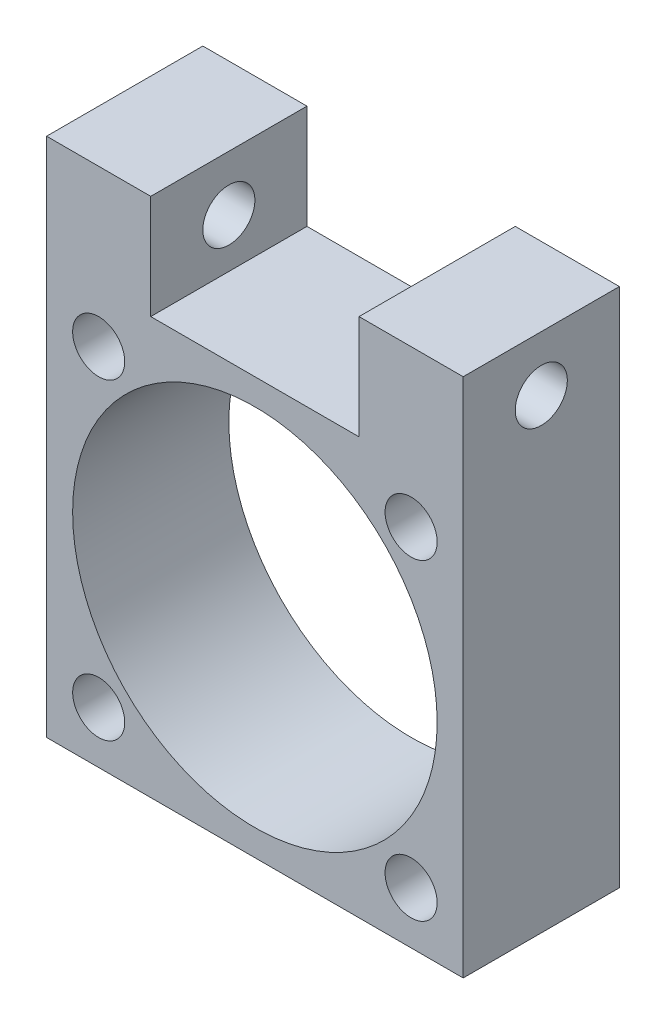
ISO-10303-21;
HEADER;
FILE_DESCRIPTION(('STEP AP214'),'2;1');
FILE_NAME('part.step','',(''),(''),'','','');
FILE_SCHEMA(('AUTOMOTIVE_DESIGN { 1 0 10303 214 1 1 1 1 }'));
ENDSEC;
DATA;
#1=APPLICATION_CONTEXT('core data for automotive mechanical design processes');
#2=APPLICATION_PROTOCOL_DEFINITION('international standard','automotive_design',2000,#1);
#3=PRODUCT_CONTEXT('',#1,'mechanical');
#4=PRODUCT('Part','Part','',(#3));
#5=PRODUCT_RELATED_PRODUCT_CATEGORY('part','',(#4));
#6=PRODUCT_DEFINITION_FORMATION('','',#4);
#7=PRODUCT_DEFINITION_CONTEXT('part definition',#1,'design');
#8=PRODUCT_DEFINITION('design','',#6,#7);
#9=PRODUCT_DEFINITION_SHAPE('','',#8);
#10=(LENGTH_UNIT() NAMED_UNIT(*) SI_UNIT(.MILLI.,.METRE.));
#11=(NAMED_UNIT(*) PLANE_ANGLE_UNIT() SI_UNIT($,.RADIAN.));
#12=(NAMED_UNIT(*) SI_UNIT($,.STERADIAN.) SOLID_ANGLE_UNIT());
#13=UNCERTAINTY_MEASURE_WITH_UNIT(LENGTH_MEASURE(1.E-05),#10,'distance_accuracy_value','');
#14=(GEOMETRIC_REPRESENTATION_CONTEXT(3) GLOBAL_UNCERTAINTY_ASSIGNED_CONTEXT((#13)) GLOBAL_UNIT_ASSIGNED_CONTEXT((#10,
#11,#12)) REPRESENTATION_CONTEXT('',''));
#15=CARTESIAN_POINT('',(0.,0.,0.));
#16=DIRECTION('',(0.,0.,1.));
#17=DIRECTION('',(1.,0.,0.));
#18=AXIS2_PLACEMENT_3D('',#15,#16,#17);
#19=CARTESIAN_POINT('',(-25.4,25.4,19.05));
#20=DIRECTION('',(1.,0.,0.));
#21=DIRECTION('',(0.,1.,0.));
#22=AXIS2_PLACEMENT_3D('',#19,#20,#21);
#23=PLANE('',#22);
#24=DIRECTION('',(0.,-1.,0.));
#25=VECTOR('',#24,1.);
#26=CARTESIAN_POINT('',(-25.4,25.4,0.));
#27=LINE('',#26,#25);
#28=CARTESIAN_POINT('',(-25.4,38.1,0.));
#29=VERTEX_POINT('',#28);
#30=CARTESIAN_POINT('',(-25.4,-25.4,0.));
#31=VERTEX_POINT('',#30);
#32=EDGE_CURVE('E163',#29,#31,#27,.T.);
#33=ORIENTED_EDGE('',*,*,#32,.T.);
#34=DIRECTION('',(0.,0.,-1.));
#35=VECTOR('',#34,1.);
#36=CARTESIAN_POINT('',(-25.4,-25.4,19.05));
#37=LINE('',#36,#35);
#38=CARTESIAN_POINT('',(-25.4,-25.4,19.05));
#39=VERTEX_POINT('',#38);
#40=EDGE_CURVE('E11',#39,#31,#37,.T.);
#41=ORIENTED_EDGE('',*,*,#40,.F.);
#42=DIRECTION('',(0.,-1.,0.));
#43=VECTOR('',#42,1.);
#44=CARTESIAN_POINT('',(-25.4,25.4,19.05));
#45=LINE('',#44,#43);
#46=CARTESIAN_POINT('',(-25.4,38.1,19.05));
#47=VERTEX_POINT('',#46);
#48=EDGE_CURVE('E164',#47,#39,#45,.T.);
#49=ORIENTED_EDGE('',*,*,#48,.F.);
#50=DIRECTION('',(0.,0.,-1.));
#51=VECTOR('',#50,1.);
#52=CARTESIAN_POINT('',(-25.4,38.1,0.));
#53=LINE('',#52,#51);
#54=EDGE_CURVE('E137',#47,#29,#53,.T.);
#55=ORIENTED_EDGE('',*,*,#54,.T.);
#56=EDGE_LOOP('',(#33,#41,#49,#55));
#57=FACE_BOUND('',#56,.T.);
#58=CARTESIAN_POINT('',(-25.4,31.3637859760362,9.525));
#59=DIRECTION('',(-1.,0.,0.));
#60=DIRECTION('',(0.,-1.,0.));
#61=AXIS2_PLACEMENT_3D('',#58,#59,#60);
#62=CIRCLE('',#61,3.175);
#63=CARTESIAN_POINT('',(-25.4,28.1887859760362,9.525));
#64=VERTEX_POINT('',#63);
#65=EDGE_CURVE('E132',#64,#64,#62,.T.);
#66=ORIENTED_EDGE('',*,*,#65,.F.);
#67=EDGE_LOOP('',(#66));
#68=FACE_BOUND('',#67,.T.);
#69=ADVANCED_FACE('F33',(#57,#68),#23,.F.);
#70=CARTESIAN_POINT('',(-25.4,-25.4,19.05));
#71=DIRECTION('',(0.,1.,0.));
#72=DIRECTION('',(0.,0.,1.));
#73=AXIS2_PLACEMENT_3D('',#70,#71,#72);
#74=PLANE('',#73);
#75=DIRECTION('',(1.,0.,0.));
#76=VECTOR('',#75,1.);
#77=CARTESIAN_POINT('',(-25.4,-25.4,0.));
#78=LINE('',#77,#76);
#79=CARTESIAN_POINT('',(25.4,-25.4,0.));
#80=VERTEX_POINT('',#79);
#81=EDGE_CURVE('E174',#31,#80,#78,.T.);
#82=ORIENTED_EDGE('',*,*,#81,.T.);
#83=DIRECTION('',(0.,0.,-1.));
#84=VECTOR('',#83,1.);
#85=CARTESIAN_POINT('',(25.4,-25.4,19.05));
#86=LINE('',#85,#84);
#87=CARTESIAN_POINT('',(25.4,-25.4,19.05));
#88=VERTEX_POINT('',#87);
#89=EDGE_CURVE('E40',#88,#80,#86,.T.);
#90=ORIENTED_EDGE('',*,*,#89,.F.);
#91=DIRECTION('',(1.,0.,0.));
#92=VECTOR('',#91,1.);
#93=CARTESIAN_POINT('',(-25.4,-25.4,19.05));
#94=LINE('',#93,#92);
#95=EDGE_CURVE('E167',#39,#88,#94,.T.);
#96=ORIENTED_EDGE('',*,*,#95,.F.);
#97=ORIENTED_EDGE('',*,*,#40,.T.);
#98=EDGE_LOOP('',(#82,#90,#96,#97));
#99=FACE_BOUND('',#98,.T.);
#100=ADVANCED_FACE('F186',(#99),#74,.F.);
#101=CARTESIAN_POINT('',(25.4,25.4,19.05));
#102=DIRECTION('',(-1.,0.,0.));
#103=DIRECTION('',(0.,-1.,0.));
#104=AXIS2_PLACEMENT_3D('',#101,#102,#103);
#105=PLANE('',#104);
#106=DIRECTION('',(0.,1.,0.));
#107=VECTOR('',#106,1.);
#108=CARTESIAN_POINT('',(25.4,25.4,0.));
#109=LINE('',#108,#107);
#110=CARTESIAN_POINT('',(25.4,38.1,0.));
#111=VERTEX_POINT('',#110);
#112=EDGE_CURVE('E176',#80,#111,#109,.T.);
#113=ORIENTED_EDGE('',*,*,#112,.T.);
#114=DIRECTION('',(0.,0.,-1.));
#115=VECTOR('',#114,1.);
#116=CARTESIAN_POINT('',(25.4,38.1,0.));
#117=LINE('',#116,#115);
#118=CARTESIAN_POINT('',(25.4,38.1,19.05));
#119=VERTEX_POINT('',#118);
#120=EDGE_CURVE('E114',#119,#111,#117,.T.);
#121=ORIENTED_EDGE('',*,*,#120,.F.);
#122=DIRECTION('',(0.,1.,0.));
#123=VECTOR('',#122,1.);
#124=CARTESIAN_POINT('',(25.4,25.4,19.05));
#125=LINE('',#124,#123);
#126=EDGE_CURVE('E169',#88,#119,#125,.T.);
#127=ORIENTED_EDGE('',*,*,#126,.F.);
#128=ORIENTED_EDGE('',*,*,#89,.T.);
#129=EDGE_LOOP('',(#113,#121,#127,#128));
#130=FACE_BOUND('',#129,.T.);
#131=CARTESIAN_POINT('',(25.4,31.3637859760362,9.525));
#132=DIRECTION('',(-1.,0.,0.));
#133=DIRECTION('',(0.,-1.,0.));
#134=AXIS2_PLACEMENT_3D('',#131,#132,#133);
#135=CIRCLE('',#134,3.175);
#136=CARTESIAN_POINT('',(25.4,28.1887859760362,9.525));
#137=VERTEX_POINT('',#136);
#138=EDGE_CURVE('E127',#137,#137,#135,.T.);
#139=ORIENTED_EDGE('',*,*,#138,.T.);
#140=EDGE_LOOP('',(#139));
#141=FACE_BOUND('',#140,.T.);
#142=ADVANCED_FACE('F182',(#130,#141),#105,.F.);
#143=CARTESIAN_POINT('',(-25.4,25.4,19.05));
#144=DIRECTION('',(0.,-1.,0.));
#145=DIRECTION('',(0.,0.,-1.));
#146=AXIS2_PLACEMENT_3D('',#143,#144,#145);
#147=PLANE('',#146);
#148=DIRECTION('',(-1.,0.,0.));
#149=VECTOR('',#148,1.);
#150=CARTESIAN_POINT('',(-25.4,25.4,19.05));
#151=LINE('',#150,#149);
#152=CARTESIAN_POINT('',(12.7,25.4,19.05));
#153=VERTEX_POINT('',#152);
#154=CARTESIAN_POINT('',(-12.7,25.4,19.05));
#155=VERTEX_POINT('',#154);
#156=EDGE_CURVE('E47',#153,#155,#151,.T.);
#157=ORIENTED_EDGE('',*,*,#156,.F.);
#158=DIRECTION('',(0.,0.,1.));
#159=VECTOR('',#158,1.);
#160=CARTESIAN_POINT('',(12.7,25.4,0.));
#161=LINE('',#160,#159);
#162=CARTESIAN_POINT('',(12.7,25.4,0.));
#163=VERTEX_POINT('',#162);
#164=EDGE_CURVE('E118',#163,#153,#161,.T.);
#165=ORIENTED_EDGE('',*,*,#164,.F.);
#166=DIRECTION('',(-1.,0.,0.));
#167=VECTOR('',#166,1.);
#168=CARTESIAN_POINT('',(-25.4,25.4,0.));
#169=LINE('',#168,#167);
#170=CARTESIAN_POINT('',(-12.7,25.4,0.));
#171=VERTEX_POINT('',#170);
#172=EDGE_CURVE('E122',#163,#171,#169,.T.);
#173=ORIENTED_EDGE('',*,*,#172,.T.);
#174=DIRECTION('',(0.,0.,1.));
#175=VECTOR('',#174,1.);
#176=CARTESIAN_POINT('',(-12.7,25.4,0.));
#177=LINE('',#176,#175);
#178=EDGE_CURVE('E142',#171,#155,#177,.T.);
#179=ORIENTED_EDGE('',*,*,#178,.T.);
#180=EDGE_LOOP('',(#157,#165,#173,#179));
#181=FACE_BOUND('',#180,.T.);
#182=ADVANCED_FACE('F197',(#181),#147,.F.);
#183=CARTESIAN_POINT('',(0.,0.,19.05));
#184=DIRECTION('',(0.,0.,1.));
#185=DIRECTION('',(1.,0.,0.));
#186=AXIS2_PLACEMENT_3D('',#183,#184,#185);
#187=PLANE('',#186);
#188=CARTESIAN_POINT('',(19.0499999999989,-19.05,19.05));
#189=DIRECTION('',(0.,0.,-1.));
#190=DIRECTION('',(-1.,0.,0.));
#191=AXIS2_PLACEMENT_3D('',#188,#189,#190);
#192=CIRCLE('',#191,3.17500000000057);
#193=CARTESIAN_POINT('',(15.8749999999984,-19.05,19.05));
#194=VERTEX_POINT('',#193);
#195=EDGE_CURVE('E380',#194,#194,#192,.T.);
#196=ORIENTED_EDGE('',*,*,#195,.T.);
#197=EDGE_LOOP('',(#196));
#198=FACE_BOUND('',#197,.T.);
#199=CARTESIAN_POINT('',(-19.0500000000011,-19.0499999999989,19.05));
#200=DIRECTION('',(0.,0.,-1.));
#201=DIRECTION('',(-1.,0.,0.));
#202=AXIS2_PLACEMENT_3D('',#199,#200,#201);
#203=CIRCLE('',#202,3.1750000000015);
#204=CARTESIAN_POINT('',(-22.2250000000026,-19.0499999999989,19.05));
#205=VERTEX_POINT('',#204);
#206=EDGE_CURVE('E408',#205,#205,#203,.T.);
#207=ORIENTED_EDGE('',*,*,#206,.T.);
#208=EDGE_LOOP('',(#207));
#209=FACE_BOUND('',#208,.T.);
#210=CARTESIAN_POINT('',(-19.05,19.0500000000011,19.05));
#211=DIRECTION('',(0.,0.,-1.));
#212=DIRECTION('',(-1.,0.,0.));
#213=AXIS2_PLACEMENT_3D('',#210,#211,#212);
#214=CIRCLE('',#213,3.1750000000011);
#215=CARTESIAN_POINT('',(-22.2250000000011,19.0500000000011,19.05));
#216=VERTEX_POINT('',#215);
#217=EDGE_CURVE('E394',#216,#216,#214,.T.);
#218=ORIENTED_EDGE('',*,*,#217,.T.);
#219=EDGE_LOOP('',(#218));
#220=FACE_BOUND('',#219,.T.);
#221=CARTESIAN_POINT('',(19.05,19.05,19.05));
#222=DIRECTION('',(0.,0.,-1.));
#223=DIRECTION('',(-1.,0.,0.));
#224=AXIS2_PLACEMENT_3D('',#221,#222,#223);
#225=CIRCLE('',#224,3.175);
#226=CARTESIAN_POINT('',(15.875,19.05,19.05));
#227=VERTEX_POINT('',#226);
#228=EDGE_CURVE('E389',#227,#227,#225,.T.);
#229=ORIENTED_EDGE('',*,*,#228,.T.);
#230=EDGE_LOOP('',(#229));
#231=FACE_BOUND('',#230,.T.);
#232=CARTESIAN_POINT('',(0.,0.,19.05));
#233=DIRECTION('',(0.,0.,1.));
#234=DIRECTION('',(1.,0.,0.));
#235=AXIS2_PLACEMENT_3D('',#232,#233,#234);
#236=CIRCLE('',#235,22.225);
#237=CARTESIAN_POINT('',(22.225,0.,19.05));
#238=VERTEX_POINT('',#237);
#239=EDGE_CURVE('E160',#238,#238,#236,.T.);
#240=ORIENTED_EDGE('',*,*,#239,.F.);
#241=EDGE_LOOP('',(#240));
#242=FACE_BOUND('',#241,.T.);
#243=ORIENTED_EDGE('',*,*,#48,.T.);
#244=ORIENTED_EDGE('',*,*,#95,.T.);
#245=ORIENTED_EDGE('',*,*,#126,.T.);
#246=DIRECTION('',(1.,0.,0.));
#247=VECTOR('',#246,1.);
#248=CARTESIAN_POINT('',(12.7,38.1,19.05));
#249=LINE('',#248,#247);
#250=CARTESIAN_POINT('',(12.7,38.1,19.05));
#251=VERTEX_POINT('',#250);
#252=EDGE_CURVE('E117',#251,#119,#249,.T.);
#253=ORIENTED_EDGE('',*,*,#252,.F.);
#254=DIRECTION('',(0.,1.,0.));
#255=VECTOR('',#254,1.);
#256=CARTESIAN_POINT('',(12.7,25.4,19.05));
#257=LINE('',#256,#255);
#258=EDGE_CURVE('E104',#153,#251,#257,.T.);
#259=ORIENTED_EDGE('',*,*,#258,.F.);
#260=ORIENTED_EDGE('',*,*,#156,.T.);
#261=DIRECTION('',(0.,1.,0.));
#262=VECTOR('',#261,1.);
#263=CARTESIAN_POINT('',(-12.7,25.4,19.05));
#264=LINE('',#263,#262);
#265=CARTESIAN_POINT('',(-12.7,38.1,19.05));
#266=VERTEX_POINT('',#265);
#267=EDGE_CURVE('E144',#155,#266,#264,.T.);
#268=ORIENTED_EDGE('',*,*,#267,.T.);
#269=DIRECTION('',(-1.,0.,0.));
#270=VECTOR('',#269,1.);
#271=CARTESIAN_POINT('',(-12.7,38.1,19.05));
#272=LINE('',#271,#270);
#273=EDGE_CURVE('E149',#266,#47,#272,.T.);
#274=ORIENTED_EDGE('',*,*,#273,.T.);
#275=EDGE_LOOP('',(#243,#244,#245,#253,#259,#260,#268,#274));
#276=FACE_BOUND('',#275,.T.);
#277=ADVANCED_FACE('F198',(#198,#209,#220,#231,#242,#276),#187,.T.);
#278=CARTESIAN_POINT('',(0.,0.,0.));
#279=DIRECTION('',(0.,0.,1.));
#280=DIRECTION('',(1.,0.,0.));
#281=AXIS2_PLACEMENT_3D('',#278,#279,#280);
#282=PLANE('',#281);
#283=CARTESIAN_POINT('',(19.0499999999989,-19.05,0.));
#284=DIRECTION('',(0.,0.,-1.));
#285=DIRECTION('',(-1.,0.,0.));
#286=AXIS2_PLACEMENT_3D('',#283,#284,#285);
#287=CIRCLE('',#286,3.17500000000057);
#288=CARTESIAN_POINT('',(15.8749999999984,-19.05,0.));
#289=VERTEX_POINT('',#288);
#290=EDGE_CURVE('E383',#289,#289,#287,.T.);
#291=ORIENTED_EDGE('',*,*,#290,.F.);
#292=EDGE_LOOP('',(#291));
#293=FACE_BOUND('',#292,.T.);
#294=CARTESIAN_POINT('',(-19.0500000000011,-19.0499999999989,0.));
#295=DIRECTION('',(0.,0.,-1.));
#296=DIRECTION('',(-1.,0.,0.));
#297=AXIS2_PLACEMENT_3D('',#294,#295,#296);
#298=CIRCLE('',#297,3.1750000000015);
#299=CARTESIAN_POINT('',(-22.2250000000026,-19.0499999999989,0.));
#300=VERTEX_POINT('',#299);
#301=EDGE_CURVE('E385',#300,#300,#298,.T.);
#302=ORIENTED_EDGE('',*,*,#301,.F.);
#303=EDGE_LOOP('',(#302));
#304=FACE_BOUND('',#303,.T.);
#305=CARTESIAN_POINT('',(-19.05,19.0500000000011,0.));
#306=DIRECTION('',(0.,0.,-1.));
#307=DIRECTION('',(-1.,0.,0.));
#308=AXIS2_PLACEMENT_3D('',#305,#306,#307);
#309=CIRCLE('',#308,3.1750000000011);
#310=CARTESIAN_POINT('',(-22.2250000000011,19.0500000000011,0.));
#311=VERTEX_POINT('',#310);
#312=EDGE_CURVE('E403',#311,#311,#309,.T.);
#313=ORIENTED_EDGE('',*,*,#312,.F.);
#314=EDGE_LOOP('',(#313));
#315=FACE_BOUND('',#314,.T.);
#316=CARTESIAN_POINT('',(19.05,19.05,0.));
#317=DIRECTION('',(0.,0.,-1.));
#318=DIRECTION('',(-1.,0.,0.));
#319=AXIS2_PLACEMENT_3D('',#316,#317,#318);
#320=CIRCLE('',#319,3.175);
#321=CARTESIAN_POINT('',(15.875,19.05,0.));
#322=VERTEX_POINT('',#321);
#323=EDGE_CURVE('E392',#322,#322,#320,.T.);
#324=ORIENTED_EDGE('',*,*,#323,.F.);
#325=EDGE_LOOP('',(#324));
#326=FACE_BOUND('',#325,.T.);
#327=CARTESIAN_POINT('',(0.,0.,0.));
#328=DIRECTION('',(0.,0.,-1.));
#329=DIRECTION('',(-1.,0.,0.));
#330=AXIS2_PLACEMENT_3D('',#327,#328,#329);
#331=CIRCLE('',#330,22.225);
#332=CARTESIAN_POINT('',(-22.225,0.,0.));
#333=VERTEX_POINT('',#332);
#334=EDGE_CURVE('E155',#333,#333,#331,.T.);
#335=ORIENTED_EDGE('',*,*,#334,.F.);
#336=EDGE_LOOP('',(#335));
#337=FACE_BOUND('',#336,.T.);
#338=ORIENTED_EDGE('',*,*,#32,.F.);
#339=DIRECTION('',(-1.,0.,0.));
#340=VECTOR('',#339,1.);
#341=CARTESIAN_POINT('',(-12.7,38.1,0.));
#342=LINE('',#341,#340);
#343=CARTESIAN_POINT('',(-12.7,38.1,0.));
#344=VERTEX_POINT('',#343);
#345=EDGE_CURVE('E152',#344,#29,#342,.T.);
#346=ORIENTED_EDGE('',*,*,#345,.F.);
#347=DIRECTION('',(0.,-1.,0.));
#348=VECTOR('',#347,1.);
#349=CARTESIAN_POINT('',(-12.7,25.4,0.));
#350=LINE('',#349,#348);
#351=EDGE_CURVE('E140',#344,#171,#350,.T.);
#352=ORIENTED_EDGE('',*,*,#351,.T.);
#353=ORIENTED_EDGE('',*,*,#172,.F.);
#354=DIRECTION('',(0.,-1.,0.));
#355=VECTOR('',#354,1.);
#356=CARTESIAN_POINT('',(12.7,25.4,0.));
#357=LINE('',#356,#355);
#358=CARTESIAN_POINT('',(12.7,38.1,0.));
#359=VERTEX_POINT('',#358);
#360=EDGE_CURVE('E103',#359,#163,#357,.T.);
#361=ORIENTED_EDGE('',*,*,#360,.F.);
#362=DIRECTION('',(1.,0.,0.));
#363=VECTOR('',#362,1.);
#364=CARTESIAN_POINT('',(12.7,38.1,0.));
#365=LINE('',#364,#363);
#366=EDGE_CURVE('E111',#359,#111,#365,.T.);
#367=ORIENTED_EDGE('',*,*,#366,.T.);
#368=ORIENTED_EDGE('',*,*,#112,.F.);
#369=ORIENTED_EDGE('',*,*,#81,.F.);
#370=EDGE_LOOP('',(#338,#346,#352,#353,#361,#367,#368,#369));
#371=FACE_BOUND('',#370,.T.);
#372=ADVANCED_FACE('F120',(#293,#304,#315,#326,#337,#371),#282,.F.);
#373=CARTESIAN_POINT('',(0.,0.,25.4));
#374=DIRECTION('',(0.,0.,-1.));
#375=DIRECTION('',(-1.,0.,0.));
#376=AXIS2_PLACEMENT_3D('',#373,#374,#375);
#377=CYLINDRICAL_SURFACE('',#376,22.225);
#378=ORIENTED_EDGE('',*,*,#239,.T.);
#379=EDGE_LOOP('',(#378));
#380=FACE_BOUND('',#379,.T.);
#381=ORIENTED_EDGE('',*,*,#334,.T.);
#382=EDGE_LOOP('',(#381));
#383=FACE_BOUND('',#382,.T.);
#384=ADVANCED_FACE('F206',(#380,#383),#377,.F.);
#385=CARTESIAN_POINT('',(-12.7,38.1,0.));
#386=DIRECTION('',(0.,1.,0.));
#387=DIRECTION('',(-1.,0.,0.));
#388=AXIS2_PLACEMENT_3D('',#385,#386,#387);
#389=PLANE('',#388);
#390=ORIENTED_EDGE('',*,*,#54,.F.);
#391=ORIENTED_EDGE('',*,*,#273,.F.);
#392=DIRECTION('',(0.,0.,-1.));
#393=VECTOR('',#392,1.);
#394=CARTESIAN_POINT('',(-12.7,38.1,0.));
#395=LINE('',#394,#393);
#396=EDGE_CURVE('E146',#266,#344,#395,.T.);
#397=ORIENTED_EDGE('',*,*,#396,.T.);
#398=ORIENTED_EDGE('',*,*,#345,.T.);
#399=EDGE_LOOP('',(#390,#391,#397,#398));
#400=FACE_BOUND('',#399,.T.);
#401=ADVANCED_FACE('F191',(#400),#389,.T.);
#402=CARTESIAN_POINT('',(-12.7,0.,0.));
#403=DIRECTION('',(1.,0.,0.));
#404=DIRECTION('',(0.,1.,0.));
#405=AXIS2_PLACEMENT_3D('',#402,#403,#404);
#406=PLANE('',#405);
#407=CARTESIAN_POINT('',(-12.7,31.3637859760362,9.525));
#408=DIRECTION('',(-1.,0.,0.));
#409=DIRECTION('',(0.,-1.,0.));
#410=AXIS2_PLACEMENT_3D('',#407,#408,#409);
#411=CIRCLE('',#410,3.175);
#412=CARTESIAN_POINT('',(-12.7,28.1887859760362,9.525));
#413=VERTEX_POINT('',#412);
#414=EDGE_CURVE('E134',#413,#413,#411,.T.);
#415=ORIENTED_EDGE('',*,*,#414,.T.);
#416=EDGE_LOOP('',(#415));
#417=FACE_BOUND('',#416,.T.);
#418=ORIENTED_EDGE('',*,*,#351,.F.);
#419=ORIENTED_EDGE('',*,*,#396,.F.);
#420=ORIENTED_EDGE('',*,*,#267,.F.);
#421=ORIENTED_EDGE('',*,*,#178,.F.);
#422=EDGE_LOOP('',(#418,#419,#420,#421));
#423=FACE_BOUND('',#422,.T.);
#424=ADVANCED_FACE('F196',(#417,#423),#406,.T.);
#425=CARTESIAN_POINT('',(-12.7,31.3637859760362,9.525));
#426=DIRECTION('',(-1.,0.,0.));
#427=DIRECTION('',(0.,-1.,0.));
#428=AXIS2_PLACEMENT_3D('',#425,#426,#427);
#429=CYLINDRICAL_SURFACE('',#428,3.175);
#430=ORIENTED_EDGE('',*,*,#414,.F.);
#431=EDGE_LOOP('',(#430));
#432=FACE_BOUND('',#431,.T.);
#433=ORIENTED_EDGE('',*,*,#65,.T.);
#434=EDGE_LOOP('',(#433));
#435=FACE_BOUND('',#434,.T.);
#436=ADVANCED_FACE('F239',(#432,#435),#429,.F.);
#437=CARTESIAN_POINT('',(12.7,0.,0.));
#438=DIRECTION('',(-1.,0.,0.));
#439=DIRECTION('',(0.,1.,0.));
#440=AXIS2_PLACEMENT_3D('',#437,#438,#439);
#441=PLANE('',#440);
#442=ORIENTED_EDGE('',*,*,#360,.T.);
#443=ORIENTED_EDGE('',*,*,#164,.T.);
#444=ORIENTED_EDGE('',*,*,#258,.T.);
#445=DIRECTION('',(0.,0.,-1.));
#446=VECTOR('',#445,1.);
#447=CARTESIAN_POINT('',(12.7,38.1,0.));
#448=LINE('',#447,#446);
#449=EDGE_CURVE('E98',#251,#359,#448,.T.);
#450=ORIENTED_EDGE('',*,*,#449,.T.);
#451=EDGE_LOOP('',(#442,#443,#444,#450));
#452=FACE_BOUND('',#451,.T.);
#453=CARTESIAN_POINT('',(12.7,31.3637859760362,9.525));
#454=DIRECTION('',(-1.,0.,0.));
#455=DIRECTION('',(0.,-1.,0.));
#456=AXIS2_PLACEMENT_3D('',#453,#454,#455);
#457=CIRCLE('',#456,3.175);
#458=CARTESIAN_POINT('',(12.7,28.1887859760362,9.525));
#459=VERTEX_POINT('',#458);
#460=EDGE_CURVE('E124',#459,#459,#457,.T.);
#461=ORIENTED_EDGE('',*,*,#460,.F.);
#462=EDGE_LOOP('',(#461));
#463=FACE_BOUND('',#462,.T.);
#464=ADVANCED_FACE('F100',(#452,#463),#441,.T.);
#465=CARTESIAN_POINT('',(12.7,38.1,0.));
#466=DIRECTION('',(0.,-1.,0.));
#467=DIRECTION('',(1.,0.,0.));
#468=AXIS2_PLACEMENT_3D('',#465,#466,#467);
#469=PLANE('',#468);
#470=ORIENTED_EDGE('',*,*,#120,.T.);
#471=ORIENTED_EDGE('',*,*,#366,.F.);
#472=ORIENTED_EDGE('',*,*,#449,.F.);
#473=ORIENTED_EDGE('',*,*,#252,.T.);
#474=EDGE_LOOP('',(#470,#471,#472,#473));
#475=FACE_BOUND('',#474,.T.);
#476=ADVANCED_FACE('F112',(#475),#469,.F.);
#477=CARTESIAN_POINT('',(12.7,31.3637859760362,9.525));
#478=DIRECTION('',(1.,0.,0.));
#479=DIRECTION('',(0.,1.,0.));
#480=AXIS2_PLACEMENT_3D('',#477,#478,#479);
#481=CYLINDRICAL_SURFACE('',#480,3.175);
#482=ORIENTED_EDGE('',*,*,#460,.T.);
#483=EDGE_LOOP('',(#482));
#484=FACE_BOUND('',#483,.T.);
#485=ORIENTED_EDGE('',*,*,#138,.F.);
#486=EDGE_LOOP('',(#485));
#487=FACE_BOUND('',#486,.T.);
#488=ADVANCED_FACE('F250',(#484,#487),#481,.F.);
#489=CARTESIAN_POINT('',(19.05,19.05,19.05));
#490=DIRECTION('',(0.,0.,-1.));
#491=DIRECTION('',(-1.,0.,0.));
#492=AXIS2_PLACEMENT_3D('',#489,#490,#491);
#493=CYLINDRICAL_SURFACE('',#492,3.175);
#494=CARTESIAN_POINT('',(15.875,19.05,19.05));
#495=CARTESIAN_POINT('',(15.875,19.05,18.8515625));
#496=CARTESIAN_POINT('',(15.875,19.05,18.653125));
#497=CARTESIAN_POINT('',(15.875,19.05,18.25625));
#498=CARTESIAN_POINT('',(15.875,19.05,18.0578125));
#499=CARTESIAN_POINT('',(15.875,19.05,17.6609375));
#500=CARTESIAN_POINT('',(15.875,19.05,17.4625));
#501=CARTESIAN_POINT('',(15.875,19.05,17.065625));
#502=CARTESIAN_POINT('',(15.875,19.05,16.8671875));
#503=CARTESIAN_POINT('',(15.875,19.05,16.4703125));
#504=CARTESIAN_POINT('',(15.875,19.05,16.271875));
#505=CARTESIAN_POINT('',(15.875,19.05,15.875));
#506=CARTESIAN_POINT('',(15.875,19.05,15.6765625));
#507=CARTESIAN_POINT('',(15.875,19.05,15.2796875));
#508=CARTESIAN_POINT('',(15.875,19.05,15.08125));
#509=CARTESIAN_POINT('',(15.875,19.05,14.684375));
#510=CARTESIAN_POINT('',(15.875,19.05,14.4859375));
#511=CARTESIAN_POINT('',(15.875,19.05,14.0890625));
#512=CARTESIAN_POINT('',(15.875,19.05,13.890625));
#513=CARTESIAN_POINT('',(15.875,19.05,13.49375));
#514=CARTESIAN_POINT('',(15.875,19.05,13.2953125));
#515=CARTESIAN_POINT('',(15.875,19.05,12.8984375));
#516=CARTESIAN_POINT('',(15.875,19.05,12.7));
#517=CARTESIAN_POINT('',(15.875,19.05,12.303125));
#518=CARTESIAN_POINT('',(15.875,19.05,12.1046875));
#519=CARTESIAN_POINT('',(15.875,19.05,11.7078125));
#520=CARTESIAN_POINT('',(15.875,19.05,11.509375));
#521=CARTESIAN_POINT('',(15.875,19.05,11.1125));
#522=CARTESIAN_POINT('',(15.875,19.05,10.9140625));
#523=CARTESIAN_POINT('',(15.875,19.05,10.5171875));
#524=CARTESIAN_POINT('',(15.875,19.05,10.31875));
#525=CARTESIAN_POINT('',(15.875,19.05,9.921875));
#526=CARTESIAN_POINT('',(15.875,19.05,9.7234375));
#527=CARTESIAN_POINT('',(15.875,19.05,9.3265625));
#528=CARTESIAN_POINT('',(15.875,19.05,9.128125));
#529=CARTESIAN_POINT('',(15.875,19.05,8.73125));
#530=CARTESIAN_POINT('',(15.875,19.05,8.5328125));
#531=CARTESIAN_POINT('',(15.875,19.05,8.1359375));
#532=CARTESIAN_POINT('',(15.875,19.05,7.9375));
#533=CARTESIAN_POINT('',(15.875,19.05,7.540625));
#534=CARTESIAN_POINT('',(15.875,19.05,7.3421875));
#535=CARTESIAN_POINT('',(15.875,19.05,6.9453125));
#536=CARTESIAN_POINT('',(15.875,19.05,6.746875));
#537=CARTESIAN_POINT('',(15.875,19.05,6.35));
#538=CARTESIAN_POINT('',(15.875,19.05,6.1515625));
#539=CARTESIAN_POINT('',(15.875,19.05,5.7546875));
#540=CARTESIAN_POINT('',(15.875,19.05,5.55625));
#541=CARTESIAN_POINT('',(15.875,19.05,5.159375));
#542=CARTESIAN_POINT('',(15.875,19.05,4.9609375));
#543=CARTESIAN_POINT('',(15.875,19.05,4.5640625));
#544=CARTESIAN_POINT('',(15.875,19.05,4.365625));
#545=CARTESIAN_POINT('',(15.875,19.05,3.96875));
#546=CARTESIAN_POINT('',(15.875,19.05,3.7703125));
#547=CARTESIAN_POINT('',(15.875,19.05,3.3734375));
#548=CARTESIAN_POINT('',(15.875,19.05,3.175));
#549=CARTESIAN_POINT('',(15.875,19.05,2.778125));
#550=CARTESIAN_POINT('',(15.875,19.05,2.5796875));
#551=CARTESIAN_POINT('',(15.875,19.05,2.1828125));
#552=CARTESIAN_POINT('',(15.875,19.05,1.984375));
#553=CARTESIAN_POINT('',(15.875,19.05,1.5875));
#554=CARTESIAN_POINT('',(15.875,19.05,1.3890625));
#555=CARTESIAN_POINT('',(15.875,19.05,0.992187500000001));
#556=CARTESIAN_POINT('',(15.875,19.05,0.793750000000001));
#557=CARTESIAN_POINT('',(15.875,19.05,0.396875));
#558=CARTESIAN_POINT('',(15.875,19.05,0.1984375));
#559=CARTESIAN_POINT('',(15.875,19.05,0.));
#560=B_SPLINE_CURVE_WITH_KNOTS('',3,(#494,#495,#496,#497,#498,#499,#500,#501,#502,#503,#504,
#505,#506,#507,#508,#509,#510,#511,#512,#513,#514,#515,#516,#517,#518,#519,#520,#521,#522,#523,
#524,#525,#526,#527,#528,#529,#530,#531,#532,#533,#534,#535,#536,#537,#538,#539,#540,#541,#542,
#543,#544,#545,#546,#547,#548,#549,#550,#551,#552,#553,#554,#555,#556,#557,#558,#559),
.UNSPECIFIED.,.F.,.F.,(4,2,2,2,2,2,2,2,2,2,2,2,2,2,2,2,2,2,2,2,2,2,2,2,2,2,2,2,2,2,2,2,4),(0.,
0.5953125,1.190625,1.7859375,2.38125,2.9765625,3.571875,4.1671875,4.7625,5.3578125,5.953125,
6.5484375,7.14375,7.7390625,8.334375,8.9296875,9.525,10.1203125,10.715625,11.3109375,11.90625,
12.5015625,13.096875,13.6921875,14.2875,14.8828125,15.478125,16.0734375,16.66875,17.2640625,
17.859375,18.4546875,19.05),.UNSPECIFIED.);
#561=EDGE_CURVE('BSEAM258',#227,#322,#560,.T.);
#562=ORIENTED_EDGE('',*,*,#228,.F.);
#563=ORIENTED_EDGE('',*,*,#323,.T.);
#564=ORIENTED_EDGE('',*,*,#561,.T.);
#565=ORIENTED_EDGE('',*,*,#561,.F.);
#566=EDGE_LOOP('',(#562,#564,#563,#565));
#567=FACE_BOUND('',#566,.T.);
#568=ADVANCED_FACE('F258',(#567),#493,.F.);
#569=CARTESIAN_POINT('',(-19.05,19.0500000000011,19.05));
#570=DIRECTION('',(0.,0.,-1.));
#571=DIRECTION('',(-1.,0.,0.));
#572=AXIS2_PLACEMENT_3D('',#569,#570,#571);
#573=CYLINDRICAL_SURFACE('',#572,3.1750000000011);
#574=CARTESIAN_POINT('',(-22.2250000000011,19.0500000000011,19.05));
#575=CARTESIAN_POINT('',(-22.2250000000011,19.0500000000011,18.8515625));
#576=CARTESIAN_POINT('',(-22.2250000000011,19.0500000000011,18.653125));
#577=CARTESIAN_POINT('',(-22.2250000000011,19.0500000000011,18.25625));
#578=CARTESIAN_POINT('',(-22.2250000000011,19.0500000000011,18.0578125));
#579=CARTESIAN_POINT('',(-22.2250000000011,19.0500000000011,17.6609375));
#580=CARTESIAN_POINT('',(-22.2250000000011,19.0500000000011,17.4625));
#581=CARTESIAN_POINT('',(-22.2250000000011,19.0500000000011,17.065625));
#582=CARTESIAN_POINT('',(-22.2250000000011,19.0500000000011,16.8671875));
#583=CARTESIAN_POINT('',(-22.2250000000011,19.0500000000011,16.4703125));
#584=CARTESIAN_POINT('',(-22.2250000000011,19.0500000000011,16.271875));
#585=CARTESIAN_POINT('',(-22.2250000000011,19.0500000000011,15.875));
#586=CARTESIAN_POINT('',(-22.2250000000011,19.0500000000011,15.6765625));
#587=CARTESIAN_POINT('',(-22.2250000000011,19.0500000000011,15.2796875));
#588=CARTESIAN_POINT('',(-22.2250000000011,19.0500000000011,15.08125));
#589=CARTESIAN_POINT('',(-22.2250000000011,19.0500000000011,14.684375));
#590=CARTESIAN_POINT('',(-22.2250000000011,19.0500000000011,14.4859375));
#591=CARTESIAN_POINT('',(-22.2250000000011,19.0500000000011,14.0890625));
#592=CARTESIAN_POINT('',(-22.2250000000011,19.0500000000011,13.890625));
#593=CARTESIAN_POINT('',(-22.2250000000011,19.0500000000011,13.49375));
#594=CARTESIAN_POINT('',(-22.2250000000011,19.0500000000011,13.2953125));
#595=CARTESIAN_POINT('',(-22.2250000000011,19.0500000000011,12.8984375));
#596=CARTESIAN_POINT('',(-22.2250000000011,19.0500000000011,12.7));
#597=CARTESIAN_POINT('',(-22.2250000000011,19.0500000000011,12.303125));
#598=CARTESIAN_POINT('',(-22.2250000000011,19.0500000000011,12.1046875));
#599=CARTESIAN_POINT('',(-22.2250000000011,19.0500000000011,11.7078125));
#600=CARTESIAN_POINT('',(-22.2250000000011,19.0500000000011,11.509375));
#601=CARTESIAN_POINT('',(-22.2250000000011,19.0500000000011,11.1125));
#602=CARTESIAN_POINT('',(-22.2250000000011,19.0500000000011,10.9140625));
#603=CARTESIAN_POINT('',(-22.2250000000011,19.0500000000011,10.5171875));
#604=CARTESIAN_POINT('',(-22.2250000000011,19.0500000000011,10.31875));
#605=CARTESIAN_POINT('',(-22.2250000000011,19.0500000000011,9.921875));
#606=CARTESIAN_POINT('',(-22.2250000000011,19.0500000000011,9.7234375));
#607=CARTESIAN_POINT('',(-22.2250000000011,19.0500000000011,9.3265625));
#608=CARTESIAN_POINT('',(-22.2250000000011,19.0500000000011,9.128125));
#609=CARTESIAN_POINT('',(-22.2250000000011,19.0500000000011,8.73125));
#610=CARTESIAN_POINT('',(-22.2250000000011,19.0500000000011,8.5328125));
#611=CARTESIAN_POINT('',(-22.2250000000011,19.0500000000011,8.1359375));
#612=CARTESIAN_POINT('',(-22.2250000000011,19.0500000000011,7.9375));
#613=CARTESIAN_POINT('',(-22.2250000000011,19.0500000000011,7.540625));
#614=CARTESIAN_POINT('',(-22.2250000000011,19.0500000000011,7.3421875));
#615=CARTESIAN_POINT('',(-22.2250000000011,19.0500000000011,6.9453125));
#616=CARTESIAN_POINT('',(-22.2250000000011,19.0500000000011,6.746875));
#617=CARTESIAN_POINT('',(-22.2250000000011,19.0500000000011,6.35));
#618=CARTESIAN_POINT('',(-22.2250000000011,19.0500000000011,6.1515625));
#619=CARTESIAN_POINT('',(-22.2250000000011,19.0500000000011,5.7546875));
#620=CARTESIAN_POINT('',(-22.2250000000011,19.0500000000011,5.55625));
#621=CARTESIAN_POINT('',(-22.2250000000011,19.0500000000011,5.159375));
#622=CARTESIAN_POINT('',(-22.2250000000011,19.0500000000011,4.9609375));
#623=CARTESIAN_POINT('',(-22.2250000000011,19.0500000000011,4.5640625));
#624=CARTESIAN_POINT('',(-22.2250000000011,19.0500000000011,4.365625));
#625=CARTESIAN_POINT('',(-22.2250000000011,19.0500000000011,3.96875));
#626=CARTESIAN_POINT('',(-22.2250000000011,19.0500000000011,3.7703125));
#627=CARTESIAN_POINT('',(-22.2250000000011,19.0500000000011,3.3734375));
#628=CARTESIAN_POINT('',(-22.2250000000011,19.0500000000011,3.175));
#629=CARTESIAN_POINT('',(-22.2250000000011,19.0500000000011,2.778125));
#630=CARTESIAN_POINT('',(-22.2250000000011,19.0500000000011,2.5796875));
#631=CARTESIAN_POINT('',(-22.2250000000011,19.0500000000011,2.1828125));
#632=CARTESIAN_POINT('',(-22.2250000000011,19.0500000000011,1.984375));
#633=CARTESIAN_POINT('',(-22.2250000000011,19.0500000000011,1.5875));
#634=CARTESIAN_POINT('',(-22.2250000000011,19.0500000000011,1.3890625));
#635=CARTESIAN_POINT('',(-22.2250000000011,19.0500000000011,0.992187500000001));
#636=CARTESIAN_POINT('',(-22.2250000000011,19.0500000000011,0.793750000000001));
#637=CARTESIAN_POINT('',(-22.2250000000011,19.0500000000011,0.396875));
#638=CARTESIAN_POINT('',(-22.2250000000011,19.0500000000011,0.1984375));
#639=CARTESIAN_POINT('',(-22.2250000000011,19.0500000000011,0.));
#640=B_SPLINE_CURVE_WITH_KNOTS('',3,(#574,#575,#576,#577,#578,#579,#580,#581,#582,#583,#584,
#585,#586,#587,#588,#589,#590,#591,#592,#593,#594,#595,#596,#597,#598,#599,#600,#601,#602,#603,
#604,#605,#606,#607,#608,#609,#610,#611,#612,#613,#614,#615,#616,#617,#618,#619,#620,#621,#622,
#623,#624,#625,#626,#627,#628,#629,#630,#631,#632,#633,#634,#635,#636,#637,#638,#639),
.UNSPECIFIED.,.F.,.F.,(4,2,2,2,2,2,2,2,2,2,2,2,2,2,2,2,2,2,2,2,2,2,2,2,2,2,2,2,2,2,2,2,4),(0.,
0.5953125,1.190625,1.7859375,2.38125,2.9765625,3.571875,4.1671875,4.7625,5.3578125,5.953125,
6.5484375,7.14375,7.7390625,8.334375,8.9296875,9.525,10.1203125,10.715625,11.3109375,11.90625,
12.5015625,13.096875,13.6921875,14.2875,14.8828125,15.478125,16.0734375,16.66875,17.2640625,
17.859375,18.4546875,19.05),.UNSPECIFIED.);
#641=EDGE_CURVE('BSEAM281',#216,#311,#640,.T.);
#642=ORIENTED_EDGE('',*,*,#217,.F.);
#643=ORIENTED_EDGE('',*,*,#312,.T.);
#644=ORIENTED_EDGE('',*,*,#641,.T.);
#645=ORIENTED_EDGE('',*,*,#641,.F.);
#646=EDGE_LOOP('',(#642,#644,#643,#645));
#647=FACE_BOUND('',#646,.T.);
#648=ADVANCED_FACE('F281',(#647),#573,.F.);
#649=CARTESIAN_POINT('',(-19.0500000000011,-19.0499999999989,19.05));
#650=DIRECTION('',(0.,0.,-1.));
#651=DIRECTION('',(-1.,0.,0.));
#652=AXIS2_PLACEMENT_3D('',#649,#650,#651);
#653=CYLINDRICAL_SURFACE('',#652,3.1750000000015);
#654=CARTESIAN_POINT('',(-22.2250000000026,-19.0499999999989,19.05));
#655=CARTESIAN_POINT('',(-22.2250000000026,-19.0499999999989,18.8515625));
#656=CARTESIAN_POINT('',(-22.2250000000026,-19.0499999999989,18.653125));
#657=CARTESIAN_POINT('',(-22.2250000000026,-19.0499999999989,18.25625));
#658=CARTESIAN_POINT('',(-22.2250000000026,-19.0499999999989,18.0578125));
#659=CARTESIAN_POINT('',(-22.2250000000026,-19.0499999999989,17.6609375));
#660=CARTESIAN_POINT('',(-22.2250000000026,-19.0499999999989,17.4625));
#661=CARTESIAN_POINT('',(-22.2250000000026,-19.0499999999989,17.065625));
#662=CARTESIAN_POINT('',(-22.2250000000026,-19.0499999999989,16.8671875));
#663=CARTESIAN_POINT('',(-22.2250000000026,-19.0499999999989,16.4703125));
#664=CARTESIAN_POINT('',(-22.2250000000026,-19.0499999999989,16.271875));
#665=CARTESIAN_POINT('',(-22.2250000000026,-19.0499999999989,15.875));
#666=CARTESIAN_POINT('',(-22.2250000000026,-19.0499999999989,15.6765625));
#667=CARTESIAN_POINT('',(-22.2250000000026,-19.0499999999989,15.2796875));
#668=CARTESIAN_POINT('',(-22.2250000000026,-19.0499999999989,15.08125));
#669=CARTESIAN_POINT('',(-22.2250000000026,-19.0499999999989,14.684375));
#670=CARTESIAN_POINT('',(-22.2250000000026,-19.0499999999989,14.4859375));
#671=CARTESIAN_POINT('',(-22.2250000000026,-19.0499999999989,14.0890625));
#672=CARTESIAN_POINT('',(-22.2250000000026,-19.0499999999989,13.890625));
#673=CARTESIAN_POINT('',(-22.2250000000026,-19.0499999999989,13.49375));
#674=CARTESIAN_POINT('',(-22.2250000000026,-19.0499999999989,13.2953125));
#675=CARTESIAN_POINT('',(-22.2250000000026,-19.0499999999989,12.8984375));
#676=CARTESIAN_POINT('',(-22.2250000000026,-19.0499999999989,12.7));
#677=CARTESIAN_POINT('',(-22.2250000000026,-19.0499999999989,12.303125));
#678=CARTESIAN_POINT('',(-22.2250000000026,-19.0499999999989,12.1046875));
#679=CARTESIAN_POINT('',(-22.2250000000026,-19.0499999999989,11.7078125));
#680=CARTESIAN_POINT('',(-22.2250000000026,-19.0499999999989,11.509375));
#681=CARTESIAN_POINT('',(-22.2250000000026,-19.0499999999989,11.1125));
#682=CARTESIAN_POINT('',(-22.2250000000026,-19.0499999999989,10.9140625));
#683=CARTESIAN_POINT('',(-22.2250000000026,-19.0499999999989,10.5171875));
#684=CARTESIAN_POINT('',(-22.2250000000026,-19.0499999999989,10.31875));
#685=CARTESIAN_POINT('',(-22.2250000000026,-19.0499999999989,9.921875));
#686=CARTESIAN_POINT('',(-22.2250000000026,-19.0499999999989,9.7234375));
#687=CARTESIAN_POINT('',(-22.2250000000026,-19.0499999999989,9.3265625));
#688=CARTESIAN_POINT('',(-22.2250000000026,-19.0499999999989,9.128125));
#689=CARTESIAN_POINT('',(-22.2250000000026,-19.0499999999989,8.73125));
#690=CARTESIAN_POINT('',(-22.2250000000026,-19.0499999999989,8.5328125));
#691=CARTESIAN_POINT('',(-22.2250000000026,-19.0499999999989,8.1359375));
#692=CARTESIAN_POINT('',(-22.2250000000026,-19.0499999999989,7.9375));
#693=CARTESIAN_POINT('',(-22.2250000000026,-19.0499999999989,7.540625));
#694=CARTESIAN_POINT('',(-22.2250000000026,-19.0499999999989,7.3421875));
#695=CARTESIAN_POINT('',(-22.2250000000026,-19.0499999999989,6.9453125));
#696=CARTESIAN_POINT('',(-22.2250000000026,-19.0499999999989,6.746875));
#697=CARTESIAN_POINT('',(-22.2250000000026,-19.0499999999989,6.35));
#698=CARTESIAN_POINT('',(-22.2250000000026,-19.0499999999989,6.1515625));
#699=CARTESIAN_POINT('',(-22.2250000000026,-19.0499999999989,5.7546875));
#700=CARTESIAN_POINT('',(-22.2250000000026,-19.0499999999989,5.55625));
#701=CARTESIAN_POINT('',(-22.2250000000026,-19.0499999999989,5.159375));
#702=CARTESIAN_POINT('',(-22.2250000000026,-19.0499999999989,4.9609375));
#703=CARTESIAN_POINT('',(-22.2250000000026,-19.0499999999989,4.5640625));
#704=CARTESIAN_POINT('',(-22.2250000000026,-19.0499999999989,4.365625));
#705=CARTESIAN_POINT('',(-22.2250000000026,-19.0499999999989,3.96875));
#706=CARTESIAN_POINT('',(-22.2250000000026,-19.0499999999989,3.7703125));
#707=CARTESIAN_POINT('',(-22.2250000000026,-19.0499999999989,3.3734375));
#708=CARTESIAN_POINT('',(-22.2250000000026,-19.0499999999989,3.175));
#709=CARTESIAN_POINT('',(-22.2250000000026,-19.0499999999989,2.778125));
#710=CARTESIAN_POINT('',(-22.2250000000026,-19.0499999999989,2.5796875));
#711=CARTESIAN_POINT('',(-22.2250000000026,-19.0499999999989,2.1828125));
#712=CARTESIAN_POINT('',(-22.2250000000026,-19.0499999999989,1.984375));
#713=CARTESIAN_POINT('',(-22.2250000000026,-19.0499999999989,1.5875));
#714=CARTESIAN_POINT('',(-22.2250000000026,-19.0499999999989,1.3890625));
#715=CARTESIAN_POINT('',(-22.2250000000026,-19.0499999999989,0.992187500000001));
#716=CARTESIAN_POINT('',(-22.2250000000026,-19.0499999999989,0.793750000000001));
#717=CARTESIAN_POINT('',(-22.2250000000026,-19.0499999999989,0.396875));
#718=CARTESIAN_POINT('',(-22.2250000000026,-19.0499999999989,0.1984375));
#719=CARTESIAN_POINT('',(-22.2250000000026,-19.0499999999989,0.));
#720=B_SPLINE_CURVE_WITH_KNOTS('',3,(#654,#655,#656,#657,#658,#659,#660,#661,#662,#663,#664,
#665,#666,#667,#668,#669,#670,#671,#672,#673,#674,#675,#676,#677,#678,#679,#680,#681,#682,#683,
#684,#685,#686,#687,#688,#689,#690,#691,#692,#693,#694,#695,#696,#697,#698,#699,#700,#701,#702,
#703,#704,#705,#706,#707,#708,#709,#710,#711,#712,#713,#714,#715,#716,#717,#718,#719),
.UNSPECIFIED.,.F.,.F.,(4,2,2,2,2,2,2,2,2,2,2,2,2,2,2,2,2,2,2,2,2,2,2,2,2,2,2,2,2,2,2,2,4),(0.,
0.5953125,1.190625,1.7859375,2.38125,2.9765625,3.571875,4.1671875,4.7625,5.3578125,5.953125,
6.5484375,7.14375,7.7390625,8.334375,8.9296875,9.525,10.1203125,10.715625,11.3109375,11.90625,
12.5015625,13.096875,13.6921875,14.2875,14.8828125,15.478125,16.0734375,16.66875,17.2640625,
17.859375,18.4546875,19.05),.UNSPECIFIED.);
#721=EDGE_CURVE('BSEAM291',#205,#300,#720,.T.);
#722=ORIENTED_EDGE('',*,*,#206,.F.);
#723=ORIENTED_EDGE('',*,*,#301,.T.);
#724=ORIENTED_EDGE('',*,*,#721,.T.);
#725=ORIENTED_EDGE('',*,*,#721,.F.);
#726=EDGE_LOOP('',(#722,#724,#723,#725));
#727=FACE_BOUND('',#726,.T.);
#728=ADVANCED_FACE('F291',(#727),#653,.F.);
#729=CARTESIAN_POINT('',(19.0499999999989,-19.05,19.05));
#730=DIRECTION('',(0.,0.,-1.));
#731=DIRECTION('',(-1.,0.,0.));
#732=AXIS2_PLACEMENT_3D('',#729,#730,#731);
#733=CYLINDRICAL_SURFACE('',#732,3.17500000000057);
#734=CARTESIAN_POINT('',(15.8749999999984,-19.05,19.05));
#735=CARTESIAN_POINT('',(15.8749999999984,-19.05,18.8515625));
#736=CARTESIAN_POINT('',(15.8749999999984,-19.05,18.653125));
#737=CARTESIAN_POINT('',(15.8749999999984,-19.05,18.25625));
#738=CARTESIAN_POINT('',(15.8749999999984,-19.05,18.0578125));
#739=CARTESIAN_POINT('',(15.8749999999984,-19.05,17.6609375));
#740=CARTESIAN_POINT('',(15.8749999999984,-19.05,17.4625));
#741=CARTESIAN_POINT('',(15.8749999999984,-19.05,17.065625));
#742=CARTESIAN_POINT('',(15.8749999999984,-19.05,16.8671875));
#743=CARTESIAN_POINT('',(15.8749999999984,-19.05,16.4703125));
#744=CARTESIAN_POINT('',(15.8749999999984,-19.05,16.271875));
#745=CARTESIAN_POINT('',(15.8749999999984,-19.05,15.875));
#746=CARTESIAN_POINT('',(15.8749999999984,-19.05,15.6765625));
#747=CARTESIAN_POINT('',(15.8749999999984,-19.05,15.2796875));
#748=CARTESIAN_POINT('',(15.8749999999984,-19.05,15.08125));
#749=CARTESIAN_POINT('',(15.8749999999984,-19.05,14.684375));
#750=CARTESIAN_POINT('',(15.8749999999984,-19.05,14.4859375));
#751=CARTESIAN_POINT('',(15.8749999999984,-19.05,14.0890625));
#752=CARTESIAN_POINT('',(15.8749999999984,-19.05,13.890625));
#753=CARTESIAN_POINT('',(15.8749999999984,-19.05,13.49375));
#754=CARTESIAN_POINT('',(15.8749999999984,-19.05,13.2953125));
#755=CARTESIAN_POINT('',(15.8749999999984,-19.05,12.8984375));
#756=CARTESIAN_POINT('',(15.8749999999984,-19.05,12.7));
#757=CARTESIAN_POINT('',(15.8749999999984,-19.05,12.303125));
#758=CARTESIAN_POINT('',(15.8749999999984,-19.05,12.1046875));
#759=CARTESIAN_POINT('',(15.8749999999984,-19.05,11.7078125));
#760=CARTESIAN_POINT('',(15.8749999999984,-19.05,11.509375));
#761=CARTESIAN_POINT('',(15.8749999999984,-19.05,11.1125));
#762=CARTESIAN_POINT('',(15.8749999999984,-19.05,10.9140625));
#763=CARTESIAN_POINT('',(15.8749999999984,-19.05,10.5171875));
#764=CARTESIAN_POINT('',(15.8749999999984,-19.05,10.31875));
#765=CARTESIAN_POINT('',(15.8749999999984,-19.05,9.921875));
#766=CARTESIAN_POINT('',(15.8749999999984,-19.05,9.7234375));
#767=CARTESIAN_POINT('',(15.8749999999984,-19.05,9.3265625));
#768=CARTESIAN_POINT('',(15.8749999999984,-19.05,9.128125));
#769=CARTESIAN_POINT('',(15.8749999999984,-19.05,8.73125));
#770=CARTESIAN_POINT('',(15.8749999999984,-19.05,8.5328125));
#771=CARTESIAN_POINT('',(15.8749999999984,-19.05,8.1359375));
#772=CARTESIAN_POINT('',(15.8749999999984,-19.05,7.9375));
#773=CARTESIAN_POINT('',(15.8749999999984,-19.05,7.540625));
#774=CARTESIAN_POINT('',(15.8749999999984,-19.05,7.3421875));
#775=CARTESIAN_POINT('',(15.8749999999984,-19.05,6.9453125));
#776=CARTESIAN_POINT('',(15.8749999999984,-19.05,6.746875));
#777=CARTESIAN_POINT('',(15.8749999999984,-19.05,6.35));
#778=CARTESIAN_POINT('',(15.8749999999984,-19.05,6.1515625));
#779=CARTESIAN_POINT('',(15.8749999999984,-19.05,5.7546875));
#780=CARTESIAN_POINT('',(15.8749999999984,-19.05,5.55625));
#781=CARTESIAN_POINT('',(15.8749999999984,-19.05,5.159375));
#782=CARTESIAN_POINT('',(15.8749999999984,-19.05,4.9609375));
#783=CARTESIAN_POINT('',(15.8749999999984,-19.05,4.5640625));
#784=CARTESIAN_POINT('',(15.8749999999984,-19.05,4.365625));
#785=CARTESIAN_POINT('',(15.8749999999984,-19.05,3.96875));
#786=CARTESIAN_POINT('',(15.8749999999984,-19.05,3.7703125));
#787=CARTESIAN_POINT('',(15.8749999999984,-19.05,3.3734375));
#788=CARTESIAN_POINT('',(15.8749999999984,-19.05,3.175));
#789=CARTESIAN_POINT('',(15.8749999999984,-19.05,2.778125));
#790=CARTESIAN_POINT('',(15.8749999999984,-19.05,2.5796875));
#791=CARTESIAN_POINT('',(15.8749999999984,-19.05,2.1828125));
#792=CARTESIAN_POINT('',(15.8749999999984,-19.05,1.984375));
#793=CARTESIAN_POINT('',(15.8749999999984,-19.05,1.5875));
#794=CARTESIAN_POINT('',(15.8749999999984,-19.05,1.3890625));
#795=CARTESIAN_POINT('',(15.8749999999984,-19.05,0.992187500000001));
#796=CARTESIAN_POINT('',(15.8749999999984,-19.05,0.793750000000001));
#797=CARTESIAN_POINT('',(15.8749999999984,-19.05,0.396875));
#798=CARTESIAN_POINT('',(15.8749999999984,-19.05,0.1984375));
#799=CARTESIAN_POINT('',(15.8749999999984,-19.05,0.));
#800=B_SPLINE_CURVE_WITH_KNOTS('',3,(#734,#735,#736,#737,#738,#739,#740,#741,#742,#743,#744,
#745,#746,#747,#748,#749,#750,#751,#752,#753,#754,#755,#756,#757,#758,#759,#760,#761,#762,#763,
#764,#765,#766,#767,#768,#769,#770,#771,#772,#773,#774,#775,#776,#777,#778,#779,#780,#781,#782,
#783,#784,#785,#786,#787,#788,#789,#790,#791,#792,#793,#794,#795,#796,#797,#798,#799),
.UNSPECIFIED.,.F.,.F.,(4,2,2,2,2,2,2,2,2,2,2,2,2,2,2,2,2,2,2,2,2,2,2,2,2,2,2,2,2,2,2,2,4),(0.,
0.5953125,1.190625,1.7859375,2.38125,2.9765625,3.571875,4.1671875,4.7625,5.3578125,5.953125,
6.5484375,7.14375,7.7390625,8.334375,8.9296875,9.525,10.1203125,10.715625,11.3109375,11.90625,
12.5015625,13.096875,13.6921875,14.2875,14.8828125,15.478125,16.0734375,16.66875,17.2640625,
17.859375,18.4546875,19.05),.UNSPECIFIED.);
#801=EDGE_CURVE('BSEAM301',#194,#289,#800,.T.);
#802=ORIENTED_EDGE('',*,*,#195,.F.);
#803=ORIENTED_EDGE('',*,*,#290,.T.);
#804=ORIENTED_EDGE('',*,*,#801,.T.);
#805=ORIENTED_EDGE('',*,*,#801,.F.);
#806=EDGE_LOOP('',(#802,#804,#803,#805));
#807=FACE_BOUND('',#806,.T.);
#808=ADVANCED_FACE('F301',(#807),#733,.F.);
#809=CLOSED_SHELL('',(#69,#100,#142,#182,#277,#372,#384,#401,#424,#436,#464,#476,#488,#568,#648,
#728,#808));
#810=MANIFOLD_SOLID_BREP('B2',#809);
#811=ADVANCED_BREP_SHAPE_REPRESENTATION('',(#18,#810),#14);
#812=SHAPE_DEFINITION_REPRESENTATION(#9,#811);
ENDSEC;
END-ISO-10303-21;
